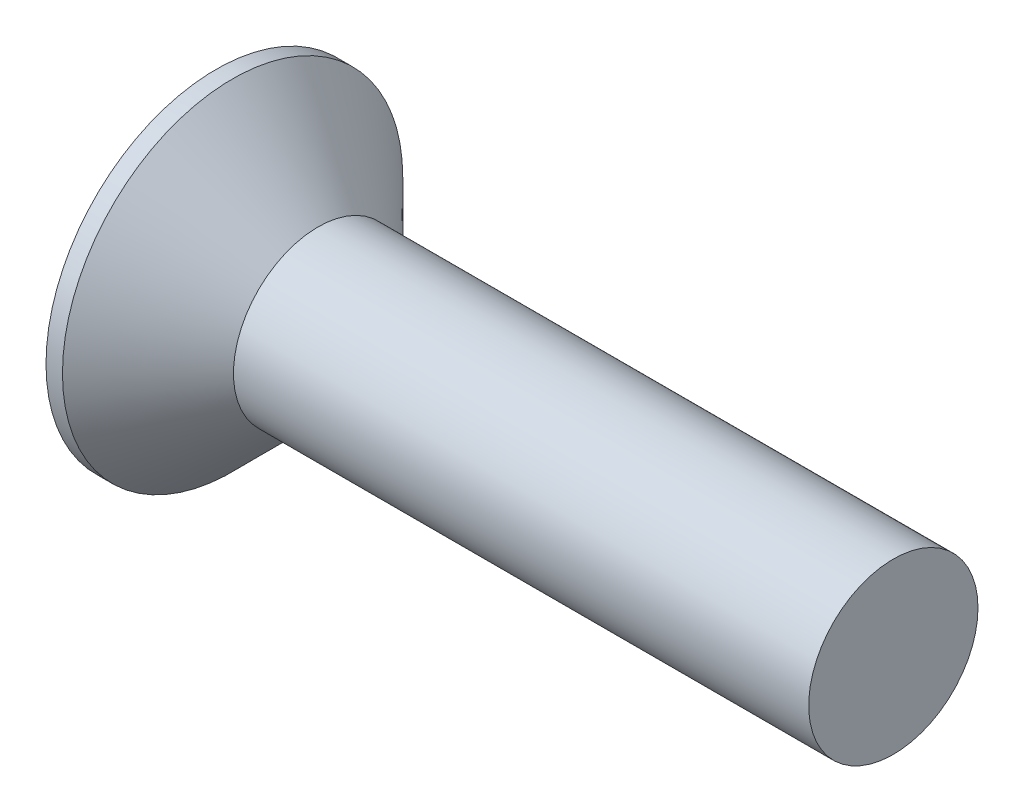
ISO-10303-21;
HEADER;
FILE_DESCRIPTION(('STEP AP214'),'2;1');
FILE_NAME('part.step','',(''),(''),'','','');
FILE_SCHEMA(('AUTOMOTIVE_DESIGN { 1 0 10303 214 1 1 1 1 }'));
ENDSEC;
DATA;
#1=APPLICATION_CONTEXT('core data for automotive mechanical design processes');
#2=APPLICATION_PROTOCOL_DEFINITION('international standard','automotive_design',2000,#1);
#3=PRODUCT_CONTEXT('',#1,'mechanical');
#4=PRODUCT('Part','Part','',(#3));
#5=PRODUCT_RELATED_PRODUCT_CATEGORY('part','',(#4));
#6=PRODUCT_DEFINITION_FORMATION('','',#4);
#7=PRODUCT_DEFINITION_CONTEXT('part definition',#1,'design');
#8=PRODUCT_DEFINITION('design','',#6,#7);
#9=PRODUCT_DEFINITION_SHAPE('','',#8);
#10=(LENGTH_UNIT() NAMED_UNIT(*) SI_UNIT(.MILLI.,.METRE.));
#11=(NAMED_UNIT(*) PLANE_ANGLE_UNIT() SI_UNIT($,.RADIAN.));
#12=(NAMED_UNIT(*) SI_UNIT($,.STERADIAN.) SOLID_ANGLE_UNIT());
#13=UNCERTAINTY_MEASURE_WITH_UNIT(LENGTH_MEASURE(1.E-05),#10,'distance_accuracy_value','');
#14=(GEOMETRIC_REPRESENTATION_CONTEXT(3) GLOBAL_UNCERTAINTY_ASSIGNED_CONTEXT((#13)) GLOBAL_UNIT_ASSIGNED_CONTEXT((#10,
#11,#12)) REPRESENTATION_CONTEXT('',''));
#15=CARTESIAN_POINT('',(0.,0.,0.));
#16=DIRECTION('',(0.,0.,1.));
#17=DIRECTION('',(1.,0.,0.));
#18=AXIS2_PLACEMENT_3D('',#15,#16,#17);
#19=CARTESIAN_POINT('',(16.,2.,0.));
#20=DIRECTION('',(1.,0.,0.));
#21=DIRECTION('',(0.,0.,-1.));
#22=AXIS2_PLACEMENT_3D('',#19,#20,#21);
#23=PLANE('',#22);
#24=CARTESIAN_POINT('',(16.,0.,0.));
#25=DIRECTION('',(1.,0.,0.));
#26=DIRECTION('',(0.,0.,-1.));
#27=AXIS2_PLACEMENT_3D('',#24,#25,#26);
#28=CIRCLE('',#27,2.);
#29=CARTESIAN_POINT('',(16.,0.,-2.));
#30=VERTEX_POINT('',#29);
#31=EDGE_CURVE('E211',#30,#30,#28,.T.);
#32=ORIENTED_EDGE('',*,*,#31,.T.);
#33=EDGE_LOOP('',(#32));
#34=FACE_BOUND('',#33,.T.);
#35=ADVANCED_FACE('F38',(#34),#23,.T.);
#36=CARTESIAN_POINT('',(7.5802,0.,0.));
#37=DIRECTION('',(0.,0.,1.));
#38=DIRECTION('',(1.,0.,0.));
#39=AXIS2_PLACEMENT_3D('',#36,#37,#38);
#40=SPHERICAL_SURFACE('',#39,8.5802);
#41=CARTESIAN_POINT('',(7.5802,-0.52,0.));
#42=DIRECTION('',(0.,-1.,0.));
#43=DIRECTION('',(0.,0.,-1.));
#44=AXIS2_PLACEMENT_3D('',#41,#42,#43);
#45=CIRCLE('',#44,8.56442829615614);
#46=CARTESIAN_POINT('',(-0.94488252394075,-0.52,0.82));
#47=VERTEX_POINT('',#46);
#48=CARTESIAN_POINT('',(-0.642881514556589,-0.52,2.39381754629665));
#49=VERTEX_POINT('',#48);
#50=EDGE_CURVE('E215',#47,#49,#45,.F.);
#51=ORIENTED_EDGE('',*,*,#50,.F.);
#52=CARTESIAN_POINT('',(-0.944882523940752,-0.52,0.82));
#53=CARTESIAN_POINT('',(-0.946496413086401,-0.519985429341335,0.803235812009232));
#54=CARTESIAN_POINT('',(-0.947973041501414,-0.521404422380354,0.786460421215536));
#55=CARTESIAN_POINT('',(-0.950615213062692,-0.527017266247943,0.753364212024367));
#56=CARTESIAN_POINT('',(-0.951780921315384,-0.531209640208499,0.737043156504142));
#57=CARTESIAN_POINT('',(-0.953767159572397,-0.542280929223082,0.705302938832412));
#58=CARTESIAN_POINT('',(-0.9545874535928,-0.549161674781274,0.689884399443861));
#59=CARTESIAN_POINT('',(-0.955857698467695,-0.565414075217039,0.660409960942214));
#60=CARTESIAN_POINT('',(-0.956307750292035,-0.574785050053866,0.646353691243617));
#61=CARTESIAN_POINT('',(-0.956823039111023,-0.59570198224697,0.620072246975522));
#62=CARTESIAN_POINT('',(-0.956890185946735,-0.607236848202828,0.607838281592191));
#63=CARTESIAN_POINT('',(-0.956642768280107,-0.632185651347958,0.585465326969151));
#64=CARTESIAN_POINT('',(-0.956328140549545,-0.645599899468697,0.575326685075368));
#65=CARTESIAN_POINT('',(-0.955327583942491,-0.673889950952749,0.557452214457206));
#66=CARTESIAN_POINT('',(-0.954642430705577,-0.688762648214999,0.549711419252245));
#67=CARTESIAN_POINT('',(-0.952921262332834,-0.719568741971409,0.536818025542981));
#68=CARTESIAN_POINT('',(-0.951885402694934,-0.735501665865906,0.531664282488683));
#69=CARTESIAN_POINT('',(-0.94986515764768,-0.762930167102684,0.525253444522641));
#70=CARTESIAN_POINT('',(-0.948964286698497,-0.774270855246404,0.523283752106301));
#71=CARTESIAN_POINT('',(-0.947024191751263,-0.797075039957698,0.520657011329026));
#72=CARTESIAN_POINT('',(-0.945985167295901,-0.808538337877665,0.519998091253768));
#73=CARTESIAN_POINT('',(-0.944882523940752,-0.82,0.52));
#74=B_SPLINE_CURVE_WITH_KNOTS('',3,(#52,#53,#54,#55,#56,#57,#58,#59,#60,#61,#62,#63,#64,#65,#66,
#67,#68,#69,#70,#71,#72,#73),.UNSPECIFIED.,.F.,.F.,(4,2,2,2,2,2,2,2,2,2,4),(0.,
0.0504620652859223,0.100897280353527,0.151366896623472,0.201822744607746,0.252026708938826,
0.302238989016728,0.352346561811542,0.402431946696577,0.436997191772968,0.471513043956105),.UNSPECIFIED.);
#75=CARTESIAN_POINT('',(-0.94488252394075,-0.82,0.52));
#76=VERTEX_POINT('',#75);
#77=EDGE_CURVE('E270',#47,#76,#74,.T.);
#78=ORIENTED_EDGE('',*,*,#77,.T.);
#79=CARTESIAN_POINT('',(7.5802,0.,0.52));
#80=DIRECTION('',(0.,0.,1.));
#81=DIRECTION('',(1.,0.,0.));
#82=AXIS2_PLACEMENT_3D('',#79,#80,#81);
#83=CIRCLE('',#82,8.56442829615614);
#84=CARTESIAN_POINT('',(-0.642881514556589,-2.39381754629665,0.52));
#85=VERTEX_POINT('',#84);
#86=EDGE_CURVE('E189',#85,#76,#83,.F.);
#87=ORIENTED_EDGE('',*,*,#86,.F.);
#88=CARTESIAN_POINT('',(6.56098302491976,1.76533558477563,0.));
#89=DIRECTION('',(-0.500000000000001,0.866025403784438,0.));
#90=DIRECTION('',(-0.866025403784438,-0.500000000000001,0.));
#91=AXIS2_PLACEMENT_3D('',#88,#89,#90);
#92=CIRCLE('',#91,8.33454372301407);
#93=CARTESIAN_POINT('',(-0.642881514556589,-2.39381754629665,-0.519999999999999));
#94=VERTEX_POINT('',#93);
#95=EDGE_CURVE('E227',#94,#85,#92,.T.);
#96=ORIENTED_EDGE('',*,*,#95,.F.);
#97=CARTESIAN_POINT('',(7.5802,0.,-0.52));
#98=DIRECTION('',(0.,0.,-1.));
#99=DIRECTION('',(0.,1.,0.));
#100=AXIS2_PLACEMENT_3D('',#97,#98,#99);
#101=CIRCLE('',#100,8.56442829615614);
#102=CARTESIAN_POINT('',(-0.94488252394075,-0.82,-0.519999999999999));
#103=VERTEX_POINT('',#102);
#104=EDGE_CURVE('E183',#103,#94,#101,.F.);
#105=ORIENTED_EDGE('',*,*,#104,.F.);
#106=CARTESIAN_POINT('',(-0.944882523940752,-0.82,-0.52));
#107=CARTESIAN_POINT('',(-0.9464964130864,-0.803235812009231,-0.519985429341334));
#108=CARTESIAN_POINT('',(-0.947973041501413,-0.786460421215535,-0.521404422380354));
#109=CARTESIAN_POINT('',(-0.950615213062692,-0.753364212024367,-0.527017266247943));
#110=CARTESIAN_POINT('',(-0.951780921315384,-0.737043156504141,-0.531209640208499));
#111=CARTESIAN_POINT('',(-0.953767159572397,-0.705302938832412,-0.542280929223081));
#112=CARTESIAN_POINT('',(-0.954587453592799,-0.689884399443861,-0.549161674781274));
#113=CARTESIAN_POINT('',(-0.955857698467695,-0.660409960942214,-0.565414075217038));
#114=CARTESIAN_POINT('',(-0.956307750292037,-0.646353691243617,-0.574785050053866));
#115=CARTESIAN_POINT('',(-0.956823039111025,-0.620072246975523,-0.595701982246969));
#116=CARTESIAN_POINT('',(-0.956890185946735,-0.607838281592191,-0.607236848202828));
#117=CARTESIAN_POINT('',(-0.956642768280105,-0.585465326969151,-0.632185651347957));
#118=CARTESIAN_POINT('',(-0.956328140549544,-0.575326685075368,-0.645599899468697));
#119=CARTESIAN_POINT('',(-0.955327583942491,-0.557452214457205,-0.673889950952749));
#120=CARTESIAN_POINT('',(-0.954642430705577,-0.549711419252245,-0.688762648214999));
#121=CARTESIAN_POINT('',(-0.952921262332834,-0.53681802554298,-0.719568741971409));
#122=CARTESIAN_POINT('',(-0.951885402694934,-0.531664282488683,-0.735501665865905));
#123=CARTESIAN_POINT('',(-0.94986515764768,-0.525253444522641,-0.762930167102683));
#124=CARTESIAN_POINT('',(-0.948964286698497,-0.5232837521063,-0.774270855246403));
#125=CARTESIAN_POINT('',(-0.947024191751262,-0.520657011329026,-0.797075039957697));
#126=CARTESIAN_POINT('',(-0.9459851672959,-0.519998091253767,-0.808538337877665));
#127=CARTESIAN_POINT('',(-0.94488252394075,-0.52,-0.819999999999999));
#128=B_SPLINE_CURVE_WITH_KNOTS('',3,(#106,#107,#108,#109,#110,#111,#112,#113,#114,#115,#116,
#117,#118,#119,#120,#121,#122,#123,#124,#125,#126,#127),.UNSPECIFIED.,.F.,.F.,(4,2,2,2,2,2,2,2,
2,2,4),(0.,0.0504620652859223,0.100897280353527,0.151366896623472,0.201822744607745,
0.252026708938826,0.302238989016728,0.352346561811542,0.402431946696577,0.436997191772968,
0.471513043956105),.UNSPECIFIED.);
#129=CARTESIAN_POINT('',(-0.94488252394075,-0.52,-0.819999999999999));
#130=VERTEX_POINT('',#129);
#131=EDGE_CURVE('E264',#103,#130,#128,.T.);
#132=ORIENTED_EDGE('',*,*,#131,.T.);
#133=CARTESIAN_POINT('',(7.5802,-0.52,0.));
#134=DIRECTION('',(0.,-1.,0.));
#135=DIRECTION('',(0.,0.,-1.));
#136=AXIS2_PLACEMENT_3D('',#133,#134,#135);
#137=CIRCLE('',#136,8.56442829615614);
#138=CARTESIAN_POINT('',(-0.64288151455659,-0.52,-2.39381754629665));
#139=VERTEX_POINT('',#138);
#140=EDGE_CURVE('E180',#139,#130,#137,.F.);
#141=ORIENTED_EDGE('',*,*,#140,.F.);
#142=CARTESIAN_POINT('',(6.56098302491976,0.,1.76533558477563));
#143=DIRECTION('',(-0.500000000000001,0.,0.866025403784438));
#144=DIRECTION('',(0.866025403784438,0.,0.500000000000001));
#145=AXIS2_PLACEMENT_3D('',#142,#143,#144);
#146=CIRCLE('',#145,8.33454372301407);
#147=CARTESIAN_POINT('',(-0.64288151455659,0.519999999999999,-2.39381754629665));
#148=VERTEX_POINT('',#147);
#149=EDGE_CURVE('E168',#148,#139,#146,.T.);
#150=ORIENTED_EDGE('',*,*,#149,.F.);
#151=CARTESIAN_POINT('',(7.5802,0.52,0.));
#152=DIRECTION('',(0.,1.,0.));
#153=DIRECTION('',(0.,0.,1.));
#154=AXIS2_PLACEMENT_3D('',#151,#152,#153);
#155=CIRCLE('',#154,8.56442829615614);
#156=CARTESIAN_POINT('',(-0.94488252394075,0.52,-0.819999999999999));
#157=VERTEX_POINT('',#156);
#158=EDGE_CURVE('E153',#157,#148,#155,.F.);
#159=ORIENTED_EDGE('',*,*,#158,.F.);
#160=CARTESIAN_POINT('',(-0.944882523940752,0.52,-0.82));
#161=CARTESIAN_POINT('',(-0.9464964130864,0.519985429341334,-0.803235812009231));
#162=CARTESIAN_POINT('',(-0.947973041501413,0.521404422380354,-0.786460421215535));
#163=CARTESIAN_POINT('',(-0.950615213062692,0.527017266247943,-0.753364212024366));
#164=CARTESIAN_POINT('',(-0.951780921315384,0.531209640208499,-0.737043156504141));
#165=CARTESIAN_POINT('',(-0.953767159572397,0.542280929223081,-0.705302938832412));
#166=CARTESIAN_POINT('',(-0.954587453592799,0.549161674781274,-0.689884399443861));
#167=CARTESIAN_POINT('',(-0.955857698467695,0.565414075217039,-0.660409960942214));
#168=CARTESIAN_POINT('',(-0.956307750292037,0.574785050053866,-0.646353691243617));
#169=CARTESIAN_POINT('',(-0.956823039111025,0.595701982246969,-0.620072246975522));
#170=CARTESIAN_POINT('',(-0.956890185946735,0.607236848202828,-0.607838281592191));
#171=CARTESIAN_POINT('',(-0.956642768280105,0.632185651347957,-0.585465326969151));
#172=CARTESIAN_POINT('',(-0.956328140549544,0.645599899468697,-0.575326685075367));
#173=CARTESIAN_POINT('',(-0.955327583942492,0.673889950952749,-0.557452214457205));
#174=CARTESIAN_POINT('',(-0.954642430705577,0.688762648214999,-0.549711419252245));
#175=CARTESIAN_POINT('',(-0.952921262332834,0.719568741971409,-0.53681802554298));
#176=CARTESIAN_POINT('',(-0.951885402694933,0.735501665865905,-0.531664282488682));
#177=CARTESIAN_POINT('',(-0.949865157647681,0.762930167102684,-0.525253444522641));
#178=CARTESIAN_POINT('',(-0.948964286698498,0.774270855246403,-0.5232837521063));
#179=CARTESIAN_POINT('',(-0.947024191751264,0.797075039957698,-0.520657011329026));
#180=CARTESIAN_POINT('',(-0.945985167295902,0.808538337877665,-0.519998091253767));
#181=CARTESIAN_POINT('',(-0.94488252394075,0.82,-0.52));
#182=B_SPLINE_CURVE_WITH_KNOTS('',3,(#160,#161,#162,#163,#164,#165,#166,#167,#168,#169,#170,
#171,#172,#173,#174,#175,#176,#177,#178,#179,#180,#181),.UNSPECIFIED.,.F.,.F.,(4,2,2,2,2,2,2,2,
2,2,4),(0.,0.0504620652859222,0.100897280353527,0.151366896623472,0.201822744607745,
0.252026708938826,0.302238989016728,0.352346561811542,0.402431946696577,0.436997191772968,
0.471513043956105),.UNSPECIFIED.);
#183=CARTESIAN_POINT('',(-0.94488252394075,0.82,-0.52));
#184=VERTEX_POINT('',#183);
#185=EDGE_CURVE('E247',#157,#184,#182,.T.);
#186=ORIENTED_EDGE('',*,*,#185,.T.);
#187=CARTESIAN_POINT('',(7.5802,0.,-0.52));
#188=DIRECTION('',(0.,0.,-1.));
#189=DIRECTION('',(0.,1.,0.));
#190=AXIS2_PLACEMENT_3D('',#187,#188,#189);
#191=CIRCLE('',#190,8.56442829615614);
#192=CARTESIAN_POINT('',(-0.642881514556589,2.39381754629665,-0.52));
#193=VERTEX_POINT('',#192);
#194=EDGE_CURVE('E164',#193,#184,#191,.F.);
#195=ORIENTED_EDGE('',*,*,#194,.F.);
#196=CARTESIAN_POINT('',(6.56098302491976,-1.76533558477563,0.));
#197=DIRECTION('',(-0.500000000000001,-0.866025403784438,0.));
#198=DIRECTION('',(0.866025403784438,-0.500000000000001,0.));
#199=AXIS2_PLACEMENT_3D('',#196,#197,#198);
#200=CIRCLE('',#199,8.33454372301407);
#201=CARTESIAN_POINT('',(-0.642881514556589,2.39381754629665,0.52));
#202=VERTEX_POINT('',#201);
#203=EDGE_CURVE('E197',#202,#193,#200,.T.);
#204=ORIENTED_EDGE('',*,*,#203,.F.);
#205=CARTESIAN_POINT('',(7.5802,0.,0.52));
#206=DIRECTION('',(0.,0.,1.));
#207=DIRECTION('',(1.,0.,0.));
#208=AXIS2_PLACEMENT_3D('',#205,#206,#207);
#209=CIRCLE('',#208,8.56442829615614);
#210=CARTESIAN_POINT('',(-0.94488252394075,0.82,0.52));
#211=VERTEX_POINT('',#210);
#212=EDGE_CURVE('E199',#211,#202,#209,.F.);
#213=ORIENTED_EDGE('',*,*,#212,.F.);
#214=CARTESIAN_POINT('',(-0.944882523940752,0.82,0.52));
#215=CARTESIAN_POINT('',(-0.9464964130864,0.803235812009231,0.519985429341335));
#216=CARTESIAN_POINT('',(-0.947973041501413,0.786460421215535,0.521404422380354));
#217=CARTESIAN_POINT('',(-0.950615213062692,0.753364212024367,0.527017266247944));
#218=CARTESIAN_POINT('',(-0.951780921315384,0.737043156504141,0.5312096402085));
#219=CARTESIAN_POINT('',(-0.953767159572397,0.705302938832412,0.542280929223082));
#220=CARTESIAN_POINT('',(-0.954587453592799,0.689884399443861,0.549161674781275));
#221=CARTESIAN_POINT('',(-0.955857698467695,0.660409960942214,0.565414075217039));
#222=CARTESIAN_POINT('',(-0.956307750292037,0.646353691243617,0.574785050053866));
#223=CARTESIAN_POINT('',(-0.956823039111025,0.620072246975522,0.59570198224697));
#224=CARTESIAN_POINT('',(-0.956890185946735,0.607838281592191,0.607236848202828));
#225=CARTESIAN_POINT('',(-0.956642768280105,0.585465326969151,0.632185651347958));
#226=CARTESIAN_POINT('',(-0.956328140549544,0.575326685075368,0.645599899468697));
#227=CARTESIAN_POINT('',(-0.955327583942491,0.557452214457205,0.67388995095275));
#228=CARTESIAN_POINT('',(-0.954642430705577,0.549711419252245,0.688762648215));
#229=CARTESIAN_POINT('',(-0.952921262332834,0.53681802554298,0.71956874197141));
#230=CARTESIAN_POINT('',(-0.951885402694933,0.531664282488682,0.735501665865906));
#231=CARTESIAN_POINT('',(-0.94986515764768,0.525253444522641,0.762930167102684));
#232=CARTESIAN_POINT('',(-0.948964286698497,0.5232837521063,0.774270855246404));
#233=CARTESIAN_POINT('',(-0.947024191751263,0.520657011329026,0.797075039957698));
#234=CARTESIAN_POINT('',(-0.945985167295901,0.519998091253767,0.808538337877666));
#235=CARTESIAN_POINT('',(-0.944882523940752,0.52,0.82));
#236=B_SPLINE_CURVE_WITH_KNOTS('',3,(#214,#215,#216,#217,#218,#219,#220,#221,#222,#223,#224,
#225,#226,#227,#228,#229,#230,#231,#232,#233,#234,#235),.UNSPECIFIED.,.F.,.F.,(4,2,2,2,2,2,2,2,
2,2,4),(0.,0.0504620652859223,0.100897280353527,0.151366896623472,0.201822744607745,
0.252026708938826,0.302238989016728,0.352346561811542,0.402431946696577,0.436997191772968,
0.471513043956105),.UNSPECIFIED.);
#237=CARTESIAN_POINT('',(-0.94488252394075,0.52,0.82));
#238=VERTEX_POINT('',#237);
#239=EDGE_CURVE('E240',#211,#238,#236,.T.);
#240=ORIENTED_EDGE('',*,*,#239,.T.);
#241=CARTESIAN_POINT('',(7.5802,0.52,0.));
#242=DIRECTION('',(0.,1.,0.));
#243=DIRECTION('',(0.,0.,1.));
#244=AXIS2_PLACEMENT_3D('',#241,#242,#243);
#245=CIRCLE('',#244,8.56442829615614);
#246=CARTESIAN_POINT('',(-0.642881514556589,0.52,2.39381754629665));
#247=VERTEX_POINT('',#246);
#248=EDGE_CURVE('E214',#247,#238,#245,.F.);
#249=ORIENTED_EDGE('',*,*,#248,.F.);
#250=CARTESIAN_POINT('',(6.56098302491976,0.,-1.76533558477563));
#251=DIRECTION('',(-0.500000000000001,0.,-0.866025403784438));
#252=DIRECTION('',(-0.866025403784438,0.,0.500000000000001));
#253=AXIS2_PLACEMENT_3D('',#250,#251,#252);
#254=CIRCLE('',#253,8.33454372301407);
#255=EDGE_CURVE('E212',#49,#247,#254,.T.);
#256=ORIENTED_EDGE('',*,*,#255,.F.);
#257=EDGE_LOOP('',(#51,#78,#87,#96,#105,#132,#141,#150,#159,#186,#195,#204,#213,#240,#249,#256));
#258=FACE_BOUND('',#257,.T.);
#259=CARTESIAN_POINT('',(0.,0.,0.));
#260=DIRECTION('',(1.,0.,0.));
#261=DIRECTION('',(0.,0.,-1.));
#262=AXIS2_PLACEMENT_3D('',#259,#260,#261);
#263=CIRCLE('',#262,4.02);
#264=CARTESIAN_POINT('',(0.,0.,-4.02));
#265=VERTEX_POINT('',#264);
#266=EDGE_CURVE('E181',#265,#265,#263,.T.);
#267=ORIENTED_EDGE('',*,*,#266,.F.);
#268=EDGE_LOOP('',(#267));
#269=FACE_BOUND('',#268,.T.);
#270=ADVANCED_FACE('F177',(#258,#269),#40,.T.);
#271=CARTESIAN_POINT('',(4.51581291088132,0.,0.));
#272=DIRECTION('',(1.,0.,0.));
#273=DIRECTION('',(0.,0.,-1.));
#274=AXIS2_PLACEMENT_3D('',#271,#272,#273);
#275=CYLINDRICAL_SURFACE('',#274,4.02);
#276=ORIENTED_EDGE('',*,*,#266,.T.);
#277=EDGE_LOOP('',(#276));
#278=FACE_BOUND('',#277,.T.);
#279=CARTESIAN_POINT('',(0.388867965644041,0.,0.));
#280=DIRECTION('',(1.,0.,0.));
#281=DIRECTION('',(0.,0.,-1.));
#282=AXIS2_PLACEMENT_3D('',#279,#280,#281);
#283=CIRCLE('',#282,4.02);
#284=CARTESIAN_POINT('',(0.388867965644041,0.,-4.02));
#285=VERTEX_POINT('',#284);
#286=EDGE_CURVE('E186',#285,#285,#283,.T.);
#287=ORIENTED_EDGE('',*,*,#286,.F.);
#288=EDGE_LOOP('',(#287));
#289=FACE_BOUND('',#288,.T.);
#290=ADVANCED_FACE('F257',(#278,#289),#275,.T.);
#291=CARTESIAN_POINT('',(2.40886796564404,0.,0.));
#292=DIRECTION('',(-1.,0.,0.));
#293=DIRECTION('',(0.,0.,1.));
#294=AXIS2_PLACEMENT_3D('',#291,#292,#293);
#295=CONICAL_SURFACE('',#294,2.,0.785398163397449);
#296=ORIENTED_EDGE('',*,*,#286,.T.);
#297=EDGE_LOOP('',(#296));
#298=FACE_BOUND('',#297,.T.);
#299=CARTESIAN_POINT('',(2.40886796564404,0.,0.));
#300=DIRECTION('',(1.,0.,0.));
#301=DIRECTION('',(0.,0.,-1.));
#302=AXIS2_PLACEMENT_3D('',#299,#300,#301);
#303=CIRCLE('',#302,2.);
#304=CARTESIAN_POINT('',(2.40886796564404,0.,-2.));
#305=VERTEX_POINT('',#304);
#306=EDGE_CURVE('E300',#305,#305,#303,.T.);
#307=ORIENTED_EDGE('',*,*,#306,.F.);
#308=EDGE_LOOP('',(#307));
#309=FACE_BOUND('',#308,.T.);
#310=ADVANCED_FACE('F402',(#298,#309),#295,.T.);
#311=CARTESIAN_POINT('',(4.51581291088132,0.,0.));
#312=DIRECTION('',(1.,0.,0.));
#313=DIRECTION('',(0.,0.,-1.));
#314=AXIS2_PLACEMENT_3D('',#311,#312,#313);
#315=CYLINDRICAL_SURFACE('',#314,2.);
#316=ORIENTED_EDGE('',*,*,#306,.T.);
#317=EDGE_LOOP('',(#316));
#318=FACE_BOUND('',#317,.T.);
#319=ORIENTED_EDGE('',*,*,#31,.F.);
#320=EDGE_LOOP('',(#319));
#321=FACE_BOUND('',#320,.T.);
#322=ADVANCED_FACE('F399',(#318,#321),#315,.T.);
#323=CARTESIAN_POINT('',(0.35,0.52,-0.52));
#324=DIRECTION('',(0.,1.,0.));
#325=DIRECTION('',(0.,0.,1.));
#326=AXIS2_PLACEMENT_3D('',#323,#324,#325);
#327=PLANE('',#326);
#328=DIRECTION('',(0.,0.,-1.));
#329=VECTOR('',#328,1.);
#330=CARTESIAN_POINT('',(0.35,0.52,-0.52));
#331=LINE('',#330,#329);
#332=CARTESIAN_POINT('',(0.35,0.52,-0.82));
#333=VERTEX_POINT('',#332);
#334=CARTESIAN_POINT('',(0.35,0.52,-1.820577136594));
#335=VERTEX_POINT('',#334);
#336=EDGE_CURVE('E194',#333,#335,#331,.T.);
#337=ORIENTED_EDGE('',*,*,#336,.F.);
#338=DIRECTION('',(-1.,0.,0.));
#339=VECTOR('',#338,1.);
#340=CARTESIAN_POINT('',(0.35,0.52,-0.82));
#341=LINE('',#340,#339);
#342=EDGE_CURVE('E160',#333,#157,#341,.T.);
#343=ORIENTED_EDGE('',*,*,#342,.T.);
#344=ORIENTED_EDGE('',*,*,#158,.T.);
#345=DIRECTION('',(0.866025403784438,0.,0.500000000000001));
#346=VECTOR('',#345,1.);
#347=CARTESIAN_POINT('',(0.913166419935816,0.52,-1.4954328524455));
#348=LINE('',#347,#346);
#349=EDGE_CURVE('E157',#335,#148,#348,.F.);
#350=ORIENTED_EDGE('',*,*,#349,.F.);
#351=EDGE_LOOP('',(#337,#343,#344,#350));
#352=FACE_BOUND('',#351,.T.);
#353=ADVANCED_FACE('F156',(#352),#327,.F.);
#354=CARTESIAN_POINT('',(0.35,0.52,-0.52));
#355=DIRECTION('',(0.,0.,-1.));
#356=DIRECTION('',(0.,1.,0.));
#357=AXIS2_PLACEMENT_3D('',#354,#355,#356);
#358=PLANE('',#357);
#359=ORIENTED_EDGE('',*,*,#194,.T.);
#360=DIRECTION('',(-1.,0.,0.));
#361=VECTOR('',#360,1.);
#362=CARTESIAN_POINT('',(0.35,0.82,-0.52));
#363=LINE('',#362,#361);
#364=CARTESIAN_POINT('',(0.35,0.82,-0.52));
#365=VERTEX_POINT('',#364);
#366=EDGE_CURVE('E342',#184,#365,#363,.F.);
#367=ORIENTED_EDGE('',*,*,#366,.T.);
#368=DIRECTION('',(0.,-1.,0.));
#369=VECTOR('',#368,1.);
#370=CARTESIAN_POINT('',(0.35,0.52,-0.52));
#371=LINE('',#370,#369);
#372=CARTESIAN_POINT('',(0.35,1.820577136594,-0.52));
#373=VERTEX_POINT('',#372);
#374=EDGE_CURVE('E173',#373,#365,#371,.T.);
#375=ORIENTED_EDGE('',*,*,#374,.F.);
#376=DIRECTION('',(0.866025403784438,-0.500000000000001,0.));
#377=VECTOR('',#376,1.);
#378=CARTESIAN_POINT('',(-1.,2.6,-0.52));
#379=LINE('',#378,#377);
#380=EDGE_CURVE('E203',#373,#193,#379,.F.);
#381=ORIENTED_EDGE('',*,*,#380,.T.);
#382=EDGE_LOOP('',(#359,#367,#375,#381));
#383=FACE_BOUND('',#382,.T.);
#384=ADVANCED_FACE('F358',(#383),#358,.F.);
#385=CARTESIAN_POINT('',(-1.,2.6,0.));
#386=DIRECTION('',(-0.500000000000001,-0.866025403784438,0.));
#387=DIRECTION('',(0.866025403784438,-0.500000000000001,0.));
#388=AXIS2_PLACEMENT_3D('',#385,#386,#387);
#389=PLANE('',#388);
#390=ORIENTED_EDGE('',*,*,#203,.T.);
#391=ORIENTED_EDGE('',*,*,#380,.F.);
#392=DIRECTION('',(0.,0.,1.));
#393=VECTOR('',#392,1.);
#394=CARTESIAN_POINT('',(0.35,1.820577136594,-0.52));
#395=LINE('',#394,#393);
#396=CARTESIAN_POINT('',(0.35,1.820577136594,0.52));
#397=VERTEX_POINT('',#396);
#398=EDGE_CURVE('E205',#397,#373,#395,.F.);
#399=ORIENTED_EDGE('',*,*,#398,.F.);
#400=DIRECTION('',(0.866025403784438,-0.500000000000001,0.));
#401=VECTOR('',#400,1.);
#402=CARTESIAN_POINT('',(0.913166419935816,1.4954328524455,0.52));
#403=LINE('',#402,#401);
#404=EDGE_CURVE('E200',#397,#202,#403,.F.);
#405=ORIENTED_EDGE('',*,*,#404,.T.);
#406=EDGE_LOOP('',(#390,#391,#399,#405));
#407=FACE_BOUND('',#406,.T.);
#408=ADVANCED_FACE('F361',(#407),#389,.T.);
#409=CARTESIAN_POINT('',(0.35,0.52,0.52));
#410=DIRECTION('',(0.,0.,1.));
#411=DIRECTION('',(1.,0.,0.));
#412=AXIS2_PLACEMENT_3D('',#409,#410,#411);
#413=PLANE('',#412);
#414=DIRECTION('',(0.,1.,0.));
#415=VECTOR('',#414,1.);
#416=CARTESIAN_POINT('',(0.35,0.52,0.52));
#417=LINE('',#416,#415);
#418=CARTESIAN_POINT('',(0.35,0.82,0.52));
#419=VERTEX_POINT('',#418);
#420=EDGE_CURVE('E208',#419,#397,#417,.T.);
#421=ORIENTED_EDGE('',*,*,#420,.F.);
#422=DIRECTION('',(-1.,0.,0.));
#423=VECTOR('',#422,1.);
#424=CARTESIAN_POINT('',(0.35,0.82,0.52));
#425=LINE('',#424,#423);
#426=EDGE_CURVE('E344',#419,#211,#425,.T.);
#427=ORIENTED_EDGE('',*,*,#426,.T.);
#428=ORIENTED_EDGE('',*,*,#212,.T.);
#429=ORIENTED_EDGE('',*,*,#404,.F.);
#430=EDGE_LOOP('',(#421,#427,#428,#429));
#431=FACE_BOUND('',#430,.T.);
#432=ADVANCED_FACE('F365',(#431),#413,.F.);
#433=CARTESIAN_POINT('',(0.35,0.52,0.52));
#434=DIRECTION('',(0.,1.,0.));
#435=DIRECTION('',(0.,0.,1.));
#436=AXIS2_PLACEMENT_3D('',#433,#434,#435);
#437=PLANE('',#436);
#438=ORIENTED_EDGE('',*,*,#248,.T.);
#439=DIRECTION('',(-1.,0.,0.));
#440=VECTOR('',#439,1.);
#441=CARTESIAN_POINT('',(0.35,0.52,0.82));
#442=LINE('',#441,#440);
#443=CARTESIAN_POINT('',(0.35,0.52,0.82));
#444=VERTEX_POINT('',#443);
#445=EDGE_CURVE('E54',#238,#444,#442,.F.);
#446=ORIENTED_EDGE('',*,*,#445,.T.);
#447=DIRECTION('',(0.,0.,-1.));
#448=VECTOR('',#447,1.);
#449=CARTESIAN_POINT('',(0.35,0.52,0.52));
#450=LINE('',#449,#448);
#451=CARTESIAN_POINT('',(0.35,0.52,1.820577136594));
#452=VERTEX_POINT('',#451);
#453=EDGE_CURVE('E223',#452,#444,#450,.T.);
#454=ORIENTED_EDGE('',*,*,#453,.F.);
#455=DIRECTION('',(0.866025403784438,0.,-0.500000000000001));
#456=VECTOR('',#455,1.);
#457=CARTESIAN_POINT('',(-1.,0.52,2.6));
#458=LINE('',#457,#456);
#459=EDGE_CURVE('E204',#452,#247,#458,.F.);
#460=ORIENTED_EDGE('',*,*,#459,.T.);
#461=EDGE_LOOP('',(#438,#446,#454,#460));
#462=FACE_BOUND('',#461,.T.);
#463=ADVANCED_FACE('F369',(#462),#437,.F.);
#464=CARTESIAN_POINT('',(-1.,0.,2.6));
#465=DIRECTION('',(-0.500000000000001,0.,-0.866025403784438));
#466=DIRECTION('',(-0.866025403784438,0.,0.500000000000001));
#467=AXIS2_PLACEMENT_3D('',#464,#465,#466);
#468=PLANE('',#467);
#469=ORIENTED_EDGE('',*,*,#255,.T.);
#470=ORIENTED_EDGE('',*,*,#459,.F.);
#471=DIRECTION('',(0.,-1.,0.));
#472=VECTOR('',#471,1.);
#473=CARTESIAN_POINT('',(0.35,0.52,1.820577136594));
#474=LINE('',#473,#472);
#475=CARTESIAN_POINT('',(0.35,-0.52,1.820577136594));
#476=VERTEX_POINT('',#475);
#477=EDGE_CURVE('E220',#476,#452,#474,.F.);
#478=ORIENTED_EDGE('',*,*,#477,.F.);
#479=DIRECTION('',(0.866025403784438,0.,-0.500000000000001));
#480=VECTOR('',#479,1.);
#481=CARTESIAN_POINT('',(0.913166419935816,-0.52,1.4954328524455));
#482=LINE('',#481,#480);
#483=EDGE_CURVE('E216',#476,#49,#482,.F.);
#484=ORIENTED_EDGE('',*,*,#483,.T.);
#485=EDGE_LOOP('',(#469,#470,#478,#484));
#486=FACE_BOUND('',#485,.T.);
#487=ADVANCED_FACE('F372',(#486),#468,.T.);
#488=CARTESIAN_POINT('',(0.35,-0.52,0.52));
#489=DIRECTION('',(0.,-1.,0.));
#490=DIRECTION('',(0.,0.,-1.));
#491=AXIS2_PLACEMENT_3D('',#488,#489,#490);
#492=PLANE('',#491);
#493=DIRECTION('',(0.,0.,1.));
#494=VECTOR('',#493,1.);
#495=CARTESIAN_POINT('',(0.35,-0.52,0.52));
#496=LINE('',#495,#494);
#497=CARTESIAN_POINT('',(0.35,-0.52,0.82));
#498=VERTEX_POINT('',#497);
#499=EDGE_CURVE('E224',#498,#476,#496,.T.);
#500=ORIENTED_EDGE('',*,*,#499,.F.);
#501=DIRECTION('',(-1.,0.,0.));
#502=VECTOR('',#501,1.);
#503=CARTESIAN_POINT('',(0.35,-0.52,0.82));
#504=LINE('',#503,#502);
#505=EDGE_CURVE('E163',#498,#47,#504,.T.);
#506=ORIENTED_EDGE('',*,*,#505,.T.);
#507=ORIENTED_EDGE('',*,*,#50,.T.);
#508=ORIENTED_EDGE('',*,*,#483,.F.);
#509=EDGE_LOOP('',(#500,#506,#507,#508));
#510=FACE_BOUND('',#509,.T.);
#511=ADVANCED_FACE('F376',(#510),#492,.F.);
#512=CARTESIAN_POINT('',(0.35,-0.52,0.52));
#513=DIRECTION('',(0.,0.,1.));
#514=DIRECTION('',(1.,0.,0.));
#515=AXIS2_PLACEMENT_3D('',#512,#513,#514);
#516=PLANE('',#515);
#517=ORIENTED_EDGE('',*,*,#86,.T.);
#518=DIRECTION('',(-1.,0.,0.));
#519=VECTOR('',#518,1.);
#520=CARTESIAN_POINT('',(0.35,-0.82,0.52));
#521=LINE('',#520,#519);
#522=CARTESIAN_POINT('',(0.35,-0.82,0.52));
#523=VERTEX_POINT('',#522);
#524=EDGE_CURVE('E331',#76,#523,#521,.F.);
#525=ORIENTED_EDGE('',*,*,#524,.T.);
#526=DIRECTION('',(0.,1.,0.));
#527=VECTOR('',#526,1.);
#528=CARTESIAN_POINT('',(0.35,-0.52,0.52));
#529=LINE('',#528,#527);
#530=CARTESIAN_POINT('',(0.35,-1.820577136594,0.52));
#531=VERTEX_POINT('',#530);
#532=EDGE_CURVE('E234',#531,#523,#529,.T.);
#533=ORIENTED_EDGE('',*,*,#532,.F.);
#534=DIRECTION('',(0.866025403784438,0.500000000000001,0.));
#535=VECTOR('',#534,1.);
#536=CARTESIAN_POINT('',(-1.,-2.6,0.52));
#537=LINE('',#536,#535);
#538=EDGE_CURVE('E219',#531,#85,#537,.F.);
#539=ORIENTED_EDGE('',*,*,#538,.T.);
#540=EDGE_LOOP('',(#517,#525,#533,#539));
#541=FACE_BOUND('',#540,.T.);
#542=ADVANCED_FACE('F329',(#541),#516,.F.);
#543=CARTESIAN_POINT('',(-1.,-2.6,0.));
#544=DIRECTION('',(-0.500000000000001,0.866025403784438,0.));
#545=DIRECTION('',(-0.866025403784438,-0.500000000000001,0.));
#546=AXIS2_PLACEMENT_3D('',#543,#544,#545);
#547=PLANE('',#546);
#548=ORIENTED_EDGE('',*,*,#95,.T.);
#549=ORIENTED_EDGE('',*,*,#538,.F.);
#550=DIRECTION('',(0.,0.,-1.));
#551=VECTOR('',#550,1.);
#552=CARTESIAN_POINT('',(0.35,-1.820577136594,-0.52));
#553=LINE('',#552,#551);
#554=CARTESIAN_POINT('',(0.35,-1.820577136594,-0.519999999999999));
#555=VERTEX_POINT('',#554);
#556=EDGE_CURVE('E231',#555,#531,#553,.F.);
#557=ORIENTED_EDGE('',*,*,#556,.F.);
#558=DIRECTION('',(0.866025403784438,0.500000000000001,0.));
#559=VECTOR('',#558,1.);
#560=CARTESIAN_POINT('',(0.913166419935816,-1.4954328524455,-0.519999999999999));
#561=LINE('',#560,#559);
#562=EDGE_CURVE('E196',#555,#94,#561,.F.);
#563=ORIENTED_EDGE('',*,*,#562,.T.);
#564=EDGE_LOOP('',(#548,#549,#557,#563));
#565=FACE_BOUND('',#564,.T.);
#566=ADVANCED_FACE('F324',(#565),#547,.T.);
#567=CARTESIAN_POINT('',(0.35,-0.52,-0.52));
#568=DIRECTION('',(0.,0.,-1.));
#569=DIRECTION('',(0.,1.,0.));
#570=AXIS2_PLACEMENT_3D('',#567,#568,#569);
#571=PLANE('',#570);
#572=DIRECTION('',(0.,-1.,0.));
#573=VECTOR('',#572,1.);
#574=CARTESIAN_POINT('',(0.35,-0.52,-0.52));
#575=LINE('',#574,#573);
#576=CARTESIAN_POINT('',(0.35,-0.82,-0.52));
#577=VERTEX_POINT('',#576);
#578=EDGE_CURVE('E235',#577,#555,#575,.T.);
#579=ORIENTED_EDGE('',*,*,#578,.F.);
#580=DIRECTION('',(-1.,0.,0.));
#581=VECTOR('',#580,1.);
#582=CARTESIAN_POINT('',(0.35,-0.82,-0.52));
#583=LINE('',#582,#581);
#584=EDGE_CURVE('E321',#577,#103,#583,.T.);
#585=ORIENTED_EDGE('',*,*,#584,.T.);
#586=ORIENTED_EDGE('',*,*,#104,.T.);
#587=ORIENTED_EDGE('',*,*,#562,.F.);
#588=EDGE_LOOP('',(#579,#585,#586,#587));
#589=FACE_BOUND('',#588,.T.);
#590=ADVANCED_FACE('F318',(#589),#571,.F.);
#591=CARTESIAN_POINT('',(0.35,-0.52,-0.52));
#592=DIRECTION('',(0.,-1.,0.));
#593=DIRECTION('',(0.,0.,-1.));
#594=AXIS2_PLACEMENT_3D('',#591,#592,#593);
#595=PLANE('',#594);
#596=ORIENTED_EDGE('',*,*,#140,.T.);
#597=DIRECTION('',(-1.,0.,0.));
#598=VECTOR('',#597,1.);
#599=CARTESIAN_POINT('',(0.35,-0.52,-0.82));
#600=LINE('',#599,#598);
#601=CARTESIAN_POINT('',(0.35,-0.52,-0.82));
#602=VERTEX_POINT('',#601);
#603=EDGE_CURVE('E337',#130,#602,#600,.F.);
#604=ORIENTED_EDGE('',*,*,#603,.T.);
#605=DIRECTION('',(0.,0.,1.));
#606=VECTOR('',#605,1.);
#607=CARTESIAN_POINT('',(0.35,-0.52,-0.52));
#608=LINE('',#607,#606);
#609=CARTESIAN_POINT('',(0.35,-0.52,-1.820577136594));
#610=VERTEX_POINT('',#609);
#611=EDGE_CURVE('E193',#610,#602,#608,.T.);
#612=ORIENTED_EDGE('',*,*,#611,.F.);
#613=DIRECTION('',(0.866025403784438,0.,0.500000000000001));
#614=VECTOR('',#613,1.);
#615=CARTESIAN_POINT('',(-1.,-0.520000000000001,-2.6));
#616=LINE('',#615,#614);
#617=EDGE_CURVE('E172',#610,#139,#616,.F.);
#618=ORIENTED_EDGE('',*,*,#617,.T.);
#619=EDGE_LOOP('',(#596,#604,#612,#618));
#620=FACE_BOUND('',#619,.T.);
#621=ADVANCED_FACE('F387',(#620),#595,.F.);
#622=CARTESIAN_POINT('',(-1.,0.,-2.6));
#623=DIRECTION('',(-0.500000000000001,0.,0.866025403784438));
#624=DIRECTION('',(0.866025403784438,0.,0.500000000000001));
#625=AXIS2_PLACEMENT_3D('',#622,#623,#624);
#626=PLANE('',#625);
#627=ORIENTED_EDGE('',*,*,#149,.T.);
#628=ORIENTED_EDGE('',*,*,#617,.F.);
#629=DIRECTION('',(0.,1.,0.));
#630=VECTOR('',#629,1.);
#631=CARTESIAN_POINT('',(0.35,0.519999999999999,-1.820577136594));
#632=LINE('',#631,#630);
#633=EDGE_CURVE('E171',#335,#610,#632,.F.);
#634=ORIENTED_EDGE('',*,*,#633,.F.);
#635=ORIENTED_EDGE('',*,*,#349,.T.);
#636=EDGE_LOOP('',(#627,#628,#634,#635));
#637=FACE_BOUND('',#636,.T.);
#638=ADVANCED_FACE('F167',(#637),#626,.T.);
#639=CARTESIAN_POINT('',(0.35,0.52,-0.52));
#640=DIRECTION('',(-1.,0.,0.));
#641=DIRECTION('',(0.,0.,1.));
#642=AXIS2_PLACEMENT_3D('',#639,#640,#641);
#643=PLANE('',#642);
#644=ORIENTED_EDGE('',*,*,#374,.T.);
#645=CARTESIAN_POINT('',(0.35,0.82,-0.82));
#646=DIRECTION('',(-1.,0.,0.));
#647=DIRECTION('',(0.,0.,1.));
#648=AXIS2_PLACEMENT_3D('',#645,#646,#647);
#649=CIRCLE('',#648,0.3);
#650=EDGE_CURVE('E47',#365,#333,#649,.F.);
#651=ORIENTED_EDGE('',*,*,#650,.T.);
#652=ORIENTED_EDGE('',*,*,#336,.T.);
#653=ORIENTED_EDGE('',*,*,#633,.T.);
#654=ORIENTED_EDGE('',*,*,#611,.T.);
#655=CARTESIAN_POINT('',(0.35,-0.82,-0.819999999999999));
#656=DIRECTION('',(-1.,0.,0.));
#657=DIRECTION('',(0.,0.,1.));
#658=AXIS2_PLACEMENT_3D('',#655,#656,#657);
#659=CIRCLE('',#658,0.3);
#660=EDGE_CURVE('E349',#602,#577,#659,.F.);
#661=ORIENTED_EDGE('',*,*,#660,.T.);
#662=ORIENTED_EDGE('',*,*,#578,.T.);
#663=ORIENTED_EDGE('',*,*,#556,.T.);
#664=ORIENTED_EDGE('',*,*,#532,.T.);
#665=CARTESIAN_POINT('',(0.35,-0.82,0.82));
#666=DIRECTION('',(-1.,0.,0.));
#667=DIRECTION('',(0.,0.,1.));
#668=AXIS2_PLACEMENT_3D('',#665,#666,#667);
#669=CIRCLE('',#668,0.3);
#670=EDGE_CURVE('E336',#523,#498,#669,.F.);
#671=ORIENTED_EDGE('',*,*,#670,.T.);
#672=ORIENTED_EDGE('',*,*,#499,.T.);
#673=ORIENTED_EDGE('',*,*,#477,.T.);
#674=ORIENTED_EDGE('',*,*,#453,.T.);
#675=CARTESIAN_POINT('',(0.35,0.82,0.82));
#676=DIRECTION('',(-1.,0.,0.));
#677=DIRECTION('',(0.,0.,1.));
#678=AXIS2_PLACEMENT_3D('',#675,#676,#677);
#679=CIRCLE('',#678,0.3);
#680=EDGE_CURVE('E11',#444,#419,#679,.F.);
#681=ORIENTED_EDGE('',*,*,#680,.T.);
#682=ORIENTED_EDGE('',*,*,#420,.T.);
#683=ORIENTED_EDGE('',*,*,#398,.T.);
#684=EDGE_LOOP('',(#644,#651,#652,#653,#654,#661,#662,#663,#664,#671,#672,#673,#674,#681,#682,#683));
#685=FACE_BOUND('',#684,.T.);
#686=ADVANCED_FACE('F351',(#685),#643,.T.);
#687=CARTESIAN_POINT('',(0.35,-0.82,0.82));
#688=DIRECTION('',(-1.,0.,0.));
#689=DIRECTION('',(0.,0.,1.));
#690=AXIS2_PLACEMENT_3D('',#687,#688,#689);
#691=CYLINDRICAL_SURFACE('',#690,0.3);
#692=ORIENTED_EDGE('',*,*,#670,.F.);
#693=ORIENTED_EDGE('',*,*,#524,.F.);
#694=ORIENTED_EDGE('',*,*,#77,.F.);
#695=ORIENTED_EDGE('',*,*,#505,.F.);
#696=EDGE_LOOP('',(#692,#693,#694,#695));
#697=FACE_BOUND('',#696,.T.);
#698=ADVANCED_FACE('F281',(#697),#691,.T.);
#699=CARTESIAN_POINT('',(0.35,-0.82,-0.819999999999999));
#700=DIRECTION('',(-1.,0.,0.));
#701=DIRECTION('',(0.,0.,1.));
#702=AXIS2_PLACEMENT_3D('',#699,#700,#701);
#703=CYLINDRICAL_SURFACE('',#702,0.3);
#704=ORIENTED_EDGE('',*,*,#660,.F.);
#705=ORIENTED_EDGE('',*,*,#603,.F.);
#706=ORIENTED_EDGE('',*,*,#131,.F.);
#707=ORIENTED_EDGE('',*,*,#584,.F.);
#708=EDGE_LOOP('',(#704,#705,#706,#707));
#709=FACE_BOUND('',#708,.T.);
#710=ADVANCED_FACE('F277',(#709),#703,.T.);
#711=CARTESIAN_POINT('',(0.35,0.82,-0.82));
#712=DIRECTION('',(-1.,0.,0.));
#713=DIRECTION('',(0.,0.,1.));
#714=AXIS2_PLACEMENT_3D('',#711,#712,#713);
#715=CYLINDRICAL_SURFACE('',#714,0.3);
#716=ORIENTED_EDGE('',*,*,#650,.F.);
#717=ORIENTED_EDGE('',*,*,#366,.F.);
#718=ORIENTED_EDGE('',*,*,#185,.F.);
#719=ORIENTED_EDGE('',*,*,#342,.F.);
#720=EDGE_LOOP('',(#716,#717,#718,#719));
#721=FACE_BOUND('',#720,.T.);
#722=ADVANCED_FACE('F280',(#721),#715,.T.);
#723=CARTESIAN_POINT('',(0.35,0.82,0.82));
#724=DIRECTION('',(-1.,0.,0.));
#725=DIRECTION('',(0.,0.,1.));
#726=AXIS2_PLACEMENT_3D('',#723,#724,#725);
#727=CYLINDRICAL_SURFACE('',#726,0.3);
#728=ORIENTED_EDGE('',*,*,#680,.F.);
#729=ORIENTED_EDGE('',*,*,#445,.F.);
#730=ORIENTED_EDGE('',*,*,#239,.F.);
#731=ORIENTED_EDGE('',*,*,#426,.F.);
#732=EDGE_LOOP('',(#728,#729,#730,#731));
#733=FACE_BOUND('',#732,.T.);
#734=ADVANCED_FACE('F40',(#733),#727,.T.);
#735=CLOSED_SHELL('',(#35,#270,#290,#310,#322,#353,#384,#408,#432,#463,#487,#511,#542,#566,#590,
#621,#638,#686,#698,#710,#722,#734));
#736=MANIFOLD_SOLID_BREP('B2',#735);
#737=ADVANCED_BREP_SHAPE_REPRESENTATION('',(#18,#736),#14);
#738=SHAPE_DEFINITION_REPRESENTATION(#9,#737);
ENDSEC;
END-ISO-10303-21;
